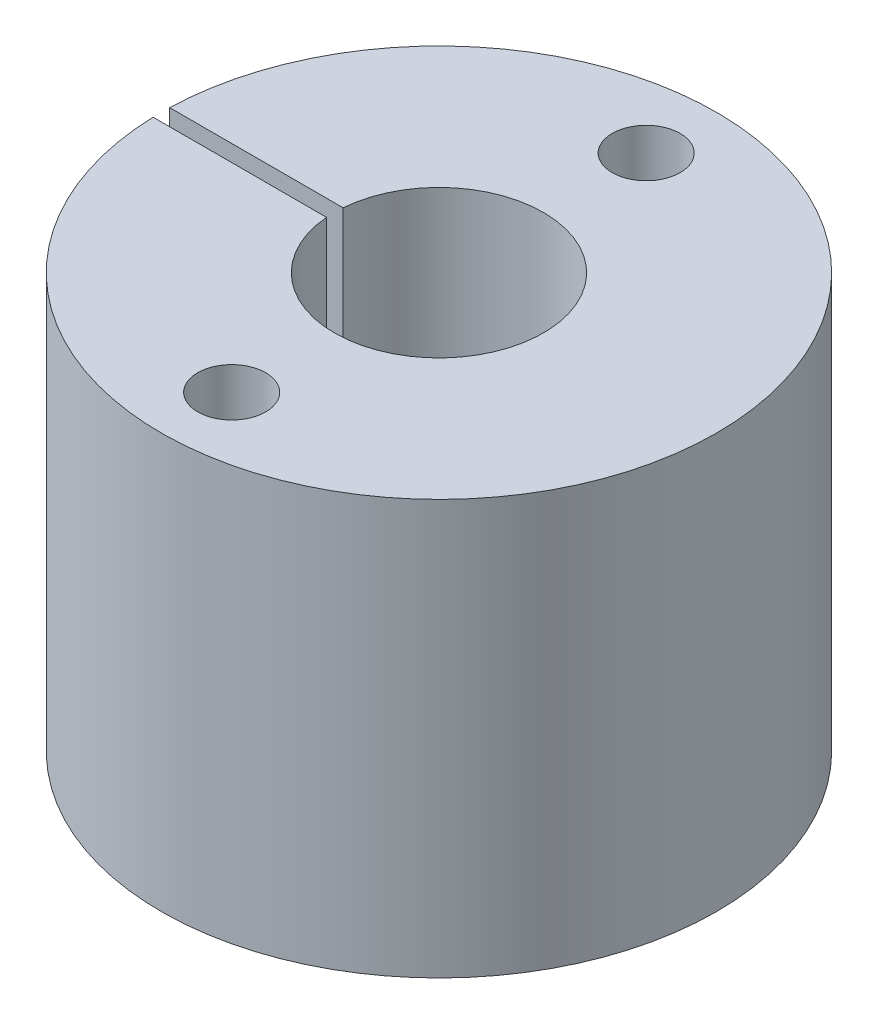
ISO-10303-21;
HEADER;
FILE_DESCRIPTION(('STEP AP214'),'2;1');
FILE_NAME('part.step','',(''),(''),'','','');
FILE_SCHEMA(('AUTOMOTIVE_DESIGN { 1 0 10303 214 1 1 1 1 }'));
ENDSEC;
DATA;
#1=APPLICATION_CONTEXT('core data for automotive mechanical design processes');
#2=APPLICATION_PROTOCOL_DEFINITION('international standard','automotive_design',2000,#1);
#3=PRODUCT_CONTEXT('',#1,'mechanical');
#4=PRODUCT('Part','Part','',(#3));
#5=PRODUCT_RELATED_PRODUCT_CATEGORY('part','',(#4));
#6=PRODUCT_DEFINITION_FORMATION('','',#4);
#7=PRODUCT_DEFINITION_CONTEXT('part definition',#1,'design');
#8=PRODUCT_DEFINITION('design','',#6,#7);
#9=PRODUCT_DEFINITION_SHAPE('','',#8);
#10=(LENGTH_UNIT() NAMED_UNIT(*) SI_UNIT(.MILLI.,.METRE.));
#11=(NAMED_UNIT(*) PLANE_ANGLE_UNIT() SI_UNIT($,.RADIAN.));
#12=(NAMED_UNIT(*) SI_UNIT($,.STERADIAN.) SOLID_ANGLE_UNIT());
#13=UNCERTAINTY_MEASURE_WITH_UNIT(LENGTH_MEASURE(1.E-05),#10,'distance_accuracy_value','');
#14=(GEOMETRIC_REPRESENTATION_CONTEXT(3) GLOBAL_UNCERTAINTY_ASSIGNED_CONTEXT((#13)) GLOBAL_UNIT_ASSIGNED_CONTEXT((#10,
#11,#12)) REPRESENTATION_CONTEXT('',''));
#15=CARTESIAN_POINT('',(0.,0.,0.));
#16=DIRECTION('',(0.,0.,1.));
#17=DIRECTION('',(1.,0.,0.));
#18=AXIS2_PLACEMENT_3D('',#15,#16,#17);
#19=CARTESIAN_POINT('',(0.,50.001,-25.));
#20=DIRECTION('',(0.,-1.,0.));
#21=DIRECTION('',(0.,0.,-1.));
#22=AXIS2_PLACEMENT_3D('',#19,#20,#21);
#23=CYLINDRICAL_SURFACE('',#22,4.1);
#24=CARTESIAN_POINT('',(0.,50.,-25.));
#25=DIRECTION('',(0.,1.,0.));
#26=DIRECTION('',(0.,0.,1.));
#27=AXIS2_PLACEMENT_3D('',#24,#25,#26);
#28=CIRCLE('',#27,4.1);
#29=CARTESIAN_POINT('',(0.,50.,-20.9));
#30=VERTEX_POINT('',#29);
#31=EDGE_CURVE('E254',#30,#30,#28,.F.);
#32=ORIENTED_EDGE('',*,*,#31,.F.);
#33=EDGE_LOOP('',(#32));
#34=FACE_BOUND('',#33,.T.);
#35=CARTESIAN_POINT('',(0.,30.,-25.));
#36=DIRECTION('',(0.,-1.,0.));
#37=DIRECTION('',(0.,0.,-1.));
#38=AXIS2_PLACEMENT_3D('',#35,#36,#37);
#39=CIRCLE('',#38,4.1);
#40=CARTESIAN_POINT('',(0.,30.,-29.1));
#41=VERTEX_POINT('',#40);
#42=EDGE_CURVE('E38',#41,#41,#39,.F.);
#43=ORIENTED_EDGE('',*,*,#42,.F.);
#44=EDGE_LOOP('',(#43));
#45=FACE_BOUND('',#44,.T.);
#46=ADVANCED_FACE('F34',(#34,#45),#23,.F.);
#47=CARTESIAN_POINT('',(0.,50.001,25.));
#48=DIRECTION('',(0.,-1.,0.));
#49=DIRECTION('',(0.,0.,-1.));
#50=AXIS2_PLACEMENT_3D('',#47,#48,#49);
#51=CYLINDRICAL_SURFACE('',#50,4.1);
#52=CARTESIAN_POINT('',(0.,50.,25.));
#53=DIRECTION('',(0.,1.,0.));
#54=DIRECTION('',(0.,0.,1.));
#55=AXIS2_PLACEMENT_3D('',#52,#53,#54);
#56=CIRCLE('',#55,4.1);
#57=CARTESIAN_POINT('',(0.,50.,29.1));
#58=VERTEX_POINT('',#57);
#59=EDGE_CURVE('E250',#58,#58,#56,.F.);
#60=ORIENTED_EDGE('',*,*,#59,.F.);
#61=EDGE_LOOP('',(#60));
#62=FACE_BOUND('',#61,.T.);
#63=CARTESIAN_POINT('',(0.,30.,25.));
#64=DIRECTION('',(0.,-1.,0.));
#65=DIRECTION('',(0.,0.,-1.));
#66=AXIS2_PLACEMENT_3D('',#63,#64,#65);
#67=CIRCLE('',#66,4.1);
#68=CARTESIAN_POINT('',(0.,30.,20.9));
#69=VERTEX_POINT('',#68);
#70=EDGE_CURVE('E197',#69,#69,#67,.F.);
#71=ORIENTED_EDGE('',*,*,#70,.F.);
#72=EDGE_LOOP('',(#71));
#73=FACE_BOUND('',#72,.T.);
#74=ADVANCED_FACE('F289',(#62,#73),#51,.F.);
#75=CARTESIAN_POINT('',(0.,50.,0.));
#76=DIRECTION('',(0.,-1.,0.));
#77=DIRECTION('',(0.,0.,-1.));
#78=AXIS2_PLACEMENT_3D('',#75,#76,#77);
#79=CYLINDRICAL_SURFACE('',#78,12.6);
#80=CARTESIAN_POINT('',(0.,0.,0.));
#81=DIRECTION('',(0.,1.,0.));
#82=DIRECTION('',(0.,0.,1.));
#83=AXIS2_PLACEMENT_3D('',#80,#81,#82);
#84=CIRCLE('',#83,12.6);
#85=CARTESIAN_POINT('',(-12.5602547744861,0.,1.));
#86=VERTEX_POINT('',#85);
#87=CARTESIAN_POINT('',(-12.5602547744861,0.,-0.999999999999997));
#88=VERTEX_POINT('',#87);
#89=EDGE_CURVE('E253',#86,#88,#84,.T.);
#90=ORIENTED_EDGE('',*,*,#89,.F.);
#91=DIRECTION('',(0.,-1.,0.));
#92=VECTOR('',#91,1.);
#93=CARTESIAN_POINT('',(-12.5602547744861,50.,1.));
#94=LINE('',#93,#92);
#95=CARTESIAN_POINT('',(-12.5602547744861,50.,1.));
#96=VERTEX_POINT('',#95);
#97=EDGE_CURVE('E11',#96,#86,#94,.T.);
#98=ORIENTED_EDGE('',*,*,#97,.F.);
#99=CARTESIAN_POINT('',(0.,50.,0.));
#100=DIRECTION('',(0.,1.,0.));
#101=DIRECTION('',(0.,0.,1.));
#102=AXIS2_PLACEMENT_3D('',#99,#100,#101);
#103=CIRCLE('',#102,12.6);
#104=CARTESIAN_POINT('',(-12.5602547744861,50.,-0.999999999999997));
#105=VERTEX_POINT('',#104);
#106=EDGE_CURVE('E257',#96,#105,#103,.T.);
#107=ORIENTED_EDGE('',*,*,#106,.T.);
#108=DIRECTION('',(0.,-1.,0.));
#109=VECTOR('',#108,1.);
#110=CARTESIAN_POINT('',(-12.5602547744861,50.,-0.999999999999997));
#111=LINE('',#110,#109);
#112=EDGE_CURVE('E267',#105,#88,#111,.T.);
#113=ORIENTED_EDGE('',*,*,#112,.T.);
#114=EDGE_LOOP('',(#90,#98,#107,#113));
#115=FACE_BOUND('',#114,.T.);
#116=ADVANCED_FACE('F36',(#115),#79,.F.);
#117=CARTESIAN_POINT('',(0.,50.,0.999999999999999));
#118=DIRECTION('',(0.,0.,1.));
#119=DIRECTION('',(1.,0.,0.));
#120=AXIS2_PLACEMENT_3D('',#117,#118,#119);
#121=PLANE('',#120);
#122=DIRECTION('',(-1.,0.,0.));
#123=VECTOR('',#122,1.);
#124=CARTESIAN_POINT('',(0.,0.,0.999999999999999));
#125=LINE('',#124,#123);
#126=CARTESIAN_POINT('',(-33.4850713005064,0.,1.));
#127=VERTEX_POINT('',#126);
#128=EDGE_CURVE('E270',#86,#127,#125,.T.);
#129=ORIENTED_EDGE('',*,*,#128,.T.);
#130=DIRECTION('',(0.,-1.,0.));
#131=VECTOR('',#130,1.);
#132=CARTESIAN_POINT('',(-33.4850713005064,50.,1.));
#133=LINE('',#132,#131);
#134=CARTESIAN_POINT('',(-33.4850713005064,50.,1.));
#135=VERTEX_POINT('',#134);
#136=EDGE_CURVE('E43',#135,#127,#133,.T.);
#137=ORIENTED_EDGE('',*,*,#136,.F.);
#138=DIRECTION('',(-1.,0.,0.));
#139=VECTOR('',#138,1.);
#140=CARTESIAN_POINT('',(0.,50.,0.999999999999999));
#141=LINE('',#140,#139);
#142=EDGE_CURVE('E260',#96,#135,#141,.T.);
#143=ORIENTED_EDGE('',*,*,#142,.F.);
#144=ORIENTED_EDGE('',*,*,#97,.T.);
#145=EDGE_LOOP('',(#129,#137,#143,#144));
#146=FACE_BOUND('',#145,.T.);
#147=ADVANCED_FACE('F314',(#146),#121,.F.);
#148=CARTESIAN_POINT('',(0.,50.,0.));
#149=DIRECTION('',(0.,-1.,0.));
#150=DIRECTION('',(0.,0.,-1.));
#151=AXIS2_PLACEMENT_3D('',#148,#149,#150);
#152=CYLINDRICAL_SURFACE('',#151,33.5);
#153=CARTESIAN_POINT('',(0.,0.,0.));
#154=DIRECTION('',(0.,1.,0.));
#155=DIRECTION('',(0.,0.,1.));
#156=AXIS2_PLACEMENT_3D('',#153,#154,#155);
#157=CIRCLE('',#156,33.5);
#158=CARTESIAN_POINT('',(-33.4850713005064,0.,-0.999999999999997));
#159=VERTEX_POINT('',#158);
#160=EDGE_CURVE('E272',#127,#159,#157,.T.);
#161=ORIENTED_EDGE('',*,*,#160,.T.);
#162=DIRECTION('',(0.,-1.,0.));
#163=VECTOR('',#162,1.);
#164=CARTESIAN_POINT('',(-33.4850713005064,50.,-0.999999999999997));
#165=LINE('',#164,#163);
#166=CARTESIAN_POINT('',(-33.4850713005064,50.,-0.999999999999997));
#167=VERTEX_POINT('',#166);
#168=EDGE_CURVE('E277',#167,#159,#165,.T.);
#169=ORIENTED_EDGE('',*,*,#168,.F.);
#170=CARTESIAN_POINT('',(0.,50.,0.));
#171=DIRECTION('',(0.,1.,0.));
#172=DIRECTION('',(0.,0.,1.));
#173=AXIS2_PLACEMENT_3D('',#170,#171,#172);
#174=CIRCLE('',#173,33.5);
#175=EDGE_CURVE('E263',#135,#167,#174,.T.);
#176=ORIENTED_EDGE('',*,*,#175,.F.);
#177=ORIENTED_EDGE('',*,*,#136,.T.);
#178=EDGE_LOOP('',(#161,#169,#176,#177));
#179=FACE_BOUND('',#178,.T.);
#180=ADVANCED_FACE('F311',(#179),#152,.T.);
#181=CARTESIAN_POINT('',(0.,50.,-0.999999999999997));
#182=DIRECTION('',(0.,0.,-1.));
#183=DIRECTION('',(-1.,0.,0.));
#184=AXIS2_PLACEMENT_3D('',#181,#182,#183);
#185=PLANE('',#184);
#186=DIRECTION('',(1.,0.,0.));
#187=VECTOR('',#186,1.);
#188=CARTESIAN_POINT('',(0.,0.,-0.999999999999997));
#189=LINE('',#188,#187);
#190=EDGE_CURVE('E261',#159,#88,#189,.T.);
#191=ORIENTED_EDGE('',*,*,#190,.T.);
#192=ORIENTED_EDGE('',*,*,#112,.F.);
#193=DIRECTION('',(1.,0.,0.));
#194=VECTOR('',#193,1.);
#195=CARTESIAN_POINT('',(0.,50.,-0.999999999999997));
#196=LINE('',#195,#194);
#197=EDGE_CURVE('E265',#167,#105,#196,.T.);
#198=ORIENTED_EDGE('',*,*,#197,.F.);
#199=ORIENTED_EDGE('',*,*,#168,.T.);
#200=EDGE_LOOP('',(#191,#192,#198,#199));
#201=FACE_BOUND('',#200,.T.);
#202=ADVANCED_FACE('F304',(#201),#185,.F.);
#203=CARTESIAN_POINT('',(0.,50.,0.));
#204=DIRECTION('',(0.,1.,0.));
#205=DIRECTION('',(0.,0.,1.));
#206=AXIS2_PLACEMENT_3D('',#203,#204,#205);
#207=PLANE('',#206);
#208=ORIENTED_EDGE('',*,*,#59,.T.);
#209=EDGE_LOOP('',(#208));
#210=FACE_BOUND('',#209,.T.);
#211=ORIENTED_EDGE('',*,*,#31,.T.);
#212=EDGE_LOOP('',(#211));
#213=FACE_BOUND('',#212,.T.);
#214=ORIENTED_EDGE('',*,*,#106,.F.);
#215=ORIENTED_EDGE('',*,*,#142,.T.);
#216=ORIENTED_EDGE('',*,*,#175,.T.);
#217=ORIENTED_EDGE('',*,*,#197,.T.);
#218=EDGE_LOOP('',(#214,#215,#216,#217));
#219=FACE_BOUND('',#218,.T.);
#220=ADVANCED_FACE('F300',(#210,#213,#219),#207,.T.);
#221=CARTESIAN_POINT('',(0.,0.,0.));
#222=DIRECTION('',(0.,1.,0.));
#223=DIRECTION('',(0.,0.,1.));
#224=AXIS2_PLACEMENT_3D('',#221,#222,#223);
#225=PLANE('',#224);
#226=DIRECTION('',(-0.00485619934996557,0.,0.999988208594418));
#227=VECTOR('',#226,1.);
#228=CARTESIAN_POINT('',(6.61842678153596,0.,21.2215840703481));
#229=LINE('',#228,#227);
#230=CARTESIAN_POINT('',(6.61842678153596,0.,21.2215840703481));
#231=VERTEX_POINT('',#230);
#232=CARTESIAN_POINT('',(6.58141757191034,0.,28.8425177610715));
#233=VERTEX_POINT('',#232);
#234=EDGE_CURVE('E184',#231,#233,#229,.T.);
#235=ORIENTED_EDGE('',*,*,#234,.F.);
#236=DIRECTION('',(0.863587092452676,0.,0.504199696300121));
#237=VECTOR('',#236,1.);
#238=CARTESIAN_POINT('',(0.0370092096256153,0.,17.3790663092766));
#239=LINE('',#238,#237);
#240=CARTESIAN_POINT('',(0.0370092096256153,0.,17.3790663092766));
#241=VERTEX_POINT('',#240);
#242=EDGE_CURVE('E51',#241,#231,#239,.T.);
#243=ORIENTED_EDGE('',*,*,#242,.F.);
#244=DIRECTION('',(0.868443291802641,0.,-0.495788512294298));
#245=VECTOR('',#244,1.);
#246=CARTESIAN_POINT('',(-6.58141757191035,0.,21.1574822389285));
#247=LINE('',#246,#245);
#248=CARTESIAN_POINT('',(-6.58141757191035,0.,21.1574822389285));
#249=VERTEX_POINT('',#248);
#250=EDGE_CURVE('E170',#249,#241,#247,.T.);
#251=ORIENTED_EDGE('',*,*,#250,.F.);
#252=DIRECTION('',(0.00485619934996533,0.,-0.999988208594418));
#253=VECTOR('',#252,1.);
#254=CARTESIAN_POINT('',(-6.61842678153597,0.,28.7784159296519));
#255=LINE('',#254,#253);
#256=CARTESIAN_POINT('',(-6.61842678153597,0.,28.7784159296519));
#257=VERTEX_POINT('',#256);
#258=EDGE_CURVE('E173',#257,#249,#255,.T.);
#259=ORIENTED_EDGE('',*,*,#258,.F.);
#260=DIRECTION('',(-0.863587092452676,0.,-0.504199696300121));
#261=VECTOR('',#260,1.);
#262=CARTESIAN_POINT('',(-0.0370092096256262,0.,32.6209336907234));
#263=LINE('',#262,#261);
#264=CARTESIAN_POINT('',(-0.0370092096256262,0.,32.6209336907234));
#265=VERTEX_POINT('',#264);
#266=EDGE_CURVE('E190',#265,#257,#263,.T.);
#267=ORIENTED_EDGE('',*,*,#266,.F.);
#268=DIRECTION('',(-0.868443291802641,0.,0.495788512294298));
#269=VECTOR('',#268,1.);
#270=CARTESIAN_POINT('',(6.58141757191034,0.,28.8425177610715));
#271=LINE('',#270,#269);
#272=EDGE_CURVE('E187',#233,#265,#271,.T.);
#273=ORIENTED_EDGE('',*,*,#272,.F.);
#274=EDGE_LOOP('',(#235,#243,#251,#259,#267,#273));
#275=FACE_BOUND('',#274,.T.);
#276=DIRECTION('',(-0.00485619934996523,0.,0.999988208594418));
#277=VECTOR('',#276,1.);
#278=CARTESIAN_POINT('',(6.61842678153598,0.,-28.7784159296519));
#279=LINE('',#278,#277);
#280=CARTESIAN_POINT('',(6.61842678153598,0.,-28.7784159296519));
#281=VERTEX_POINT('',#280);
#282=CARTESIAN_POINT('',(6.58141757191036,0.,-21.1574822389285));
#283=VERTEX_POINT('',#282);
#284=EDGE_CURVE('E226',#281,#283,#279,.T.);
#285=ORIENTED_EDGE('',*,*,#284,.F.);
#286=DIRECTION('',(0.863587092452675,0.,0.504199696300121));
#287=VECTOR('',#286,1.);
#288=CARTESIAN_POINT('',(0.0370092096256217,0.,-32.6209336907234));
#289=LINE('',#288,#287);
#290=CARTESIAN_POINT('',(0.0370092096256217,0.,-32.6209336907234));
#291=VERTEX_POINT('',#290);
#292=EDGE_CURVE('E59',#291,#281,#289,.T.);
#293=ORIENTED_EDGE('',*,*,#292,.F.);
#294=DIRECTION('',(0.868443291802641,0.,-0.495788512294298));
#295=VECTOR('',#294,1.);
#296=CARTESIAN_POINT('',(-6.58141757191034,0.,-28.8425177610715));
#297=LINE('',#296,#295);
#298=CARTESIAN_POINT('',(-6.58141757191034,0.,-28.8425177610715));
#299=VERTEX_POINT('',#298);
#300=EDGE_CURVE('E209',#299,#291,#297,.T.);
#301=ORIENTED_EDGE('',*,*,#300,.F.);
#302=DIRECTION('',(0.00485619934996534,0.,-0.999988208594418));
#303=VECTOR('',#302,1.);
#304=CARTESIAN_POINT('',(-6.61842678153596,0.,-21.2215840703481));
#305=LINE('',#304,#303);
#306=CARTESIAN_POINT('',(-6.61842678153596,0.,-21.2215840703481));
#307=VERTEX_POINT('',#306);
#308=EDGE_CURVE('E235',#307,#299,#305,.T.);
#309=ORIENTED_EDGE('',*,*,#308,.F.);
#310=DIRECTION('',(-0.863587092452676,0.,-0.504199696300121));
#311=VECTOR('',#310,1.);
#312=CARTESIAN_POINT('',(-0.0370092096256104,0.,-17.3790663092766));
#313=LINE('',#312,#311);
#314=CARTESIAN_POINT('',(-0.0370092096256104,0.,-17.3790663092766));
#315=VERTEX_POINT('',#314);
#316=EDGE_CURVE('E232',#315,#307,#313,.T.);
#317=ORIENTED_EDGE('',*,*,#316,.F.);
#318=DIRECTION('',(-0.868443291802641,0.,0.495788512294298));
#319=VECTOR('',#318,1.);
#320=CARTESIAN_POINT('',(6.58141757191036,0.,-21.1574822389285));
#321=LINE('',#320,#319);
#322=EDGE_CURVE('E229',#283,#315,#321,.T.);
#323=ORIENTED_EDGE('',*,*,#322,.F.);
#324=EDGE_LOOP('',(#285,#293,#301,#309,#317,#323));
#325=FACE_BOUND('',#324,.T.);
#326=ORIENTED_EDGE('',*,*,#89,.T.);
#327=ORIENTED_EDGE('',*,*,#190,.F.);
#328=ORIENTED_EDGE('',*,*,#160,.F.);
#329=ORIENTED_EDGE('',*,*,#128,.F.);
#330=EDGE_LOOP('',(#326,#327,#328,#329));
#331=FACE_BOUND('',#330,.T.);
#332=ADVANCED_FACE('F303',(#275,#325,#331),#225,.F.);
#333=CARTESIAN_POINT('',(0.,30.,0.));
#334=DIRECTION('',(0.,-1.,0.));
#335=DIRECTION('',(0.,0.,-1.));
#336=AXIS2_PLACEMENT_3D('',#333,#334,#335);
#337=PLANE('',#336);
#338=DIRECTION('',(0.863587092452676,0.,0.504199696300121));
#339=VECTOR('',#338,1.);
#340=CARTESIAN_POINT('',(0.0370092096256153,30.,17.3790663092766));
#341=LINE('',#340,#339);
#342=CARTESIAN_POINT('',(0.0370092096256153,30.,17.3790663092766));
#343=VERTEX_POINT('',#342);
#344=CARTESIAN_POINT('',(6.61842678153596,30.,21.2215840703481));
#345=VERTEX_POINT('',#344);
#346=EDGE_CURVE('E150',#343,#345,#341,.T.);
#347=ORIENTED_EDGE('',*,*,#346,.T.);
#348=DIRECTION('',(-0.00485619934996557,0.,0.999988208594418));
#349=VECTOR('',#348,1.);
#350=CARTESIAN_POINT('',(6.61842678153596,30.,21.2215840703481));
#351=LINE('',#350,#349);
#352=CARTESIAN_POINT('',(6.58141757191034,30.,28.8425177610715));
#353=VERTEX_POINT('',#352);
#354=EDGE_CURVE('E159',#345,#353,#351,.T.);
#355=ORIENTED_EDGE('',*,*,#354,.T.);
#356=DIRECTION('',(-0.868443291802641,0.,0.495788512294298));
#357=VECTOR('',#356,1.);
#358=CARTESIAN_POINT('',(6.58141757191034,30.,28.8425177610715));
#359=LINE('',#358,#357);
#360=CARTESIAN_POINT('',(-0.0370092096256262,30.,32.6209336907234));
#361=VERTEX_POINT('',#360);
#362=EDGE_CURVE('E164',#353,#361,#359,.T.);
#363=ORIENTED_EDGE('',*,*,#362,.T.);
#364=DIRECTION('',(-0.863587092452676,0.,-0.504199696300121));
#365=VECTOR('',#364,1.);
#366=CARTESIAN_POINT('',(-0.0370092096256262,30.,32.6209336907234));
#367=LINE('',#366,#365);
#368=CARTESIAN_POINT('',(-6.61842678153597,30.,28.7784159296519));
#369=VERTEX_POINT('',#368);
#370=EDGE_CURVE('E177',#361,#369,#367,.T.);
#371=ORIENTED_EDGE('',*,*,#370,.T.);
#372=DIRECTION('',(0.00485619934996533,0.,-0.999988208594418));
#373=VECTOR('',#372,1.);
#374=CARTESIAN_POINT('',(-6.61842678153597,30.,28.7784159296519));
#375=LINE('',#374,#373);
#376=CARTESIAN_POINT('',(-6.58141757191035,30.,21.1574822389285));
#377=VERTEX_POINT('',#376);
#378=EDGE_CURVE('E180',#369,#377,#375,.T.);
#379=ORIENTED_EDGE('',*,*,#378,.T.);
#380=DIRECTION('',(0.868443291802641,0.,-0.495788512294298));
#381=VECTOR('',#380,1.);
#382=CARTESIAN_POINT('',(-6.58141757191035,30.,21.1574822389285));
#383=LINE('',#382,#381);
#384=EDGE_CURVE('E156',#377,#343,#383,.T.);
#385=ORIENTED_EDGE('',*,*,#384,.T.);
#386=EDGE_LOOP('',(#347,#355,#363,#371,#379,#385));
#387=FACE_BOUND('',#386,.T.);
#388=ORIENTED_EDGE('',*,*,#70,.T.);
#389=EDGE_LOOP('',(#388));
#390=FACE_BOUND('',#389,.T.);
#391=ADVANCED_FACE('F166',(#387,#390),#337,.T.);
#392=CARTESIAN_POINT('',(0.0370092096256153,30.,17.3790663092766));
#393=DIRECTION('',(0.504199696300121,0.,-0.863587092452676));
#394=DIRECTION('',(-0.863587092452676,0.,-0.504199696300121));
#395=AXIS2_PLACEMENT_3D('',#392,#393,#394);
#396=PLANE('',#395);
#397=ORIENTED_EDGE('',*,*,#242,.T.);
#398=DIRECTION('',(0.,-1.,0.));
#399=VECTOR('',#398,1.);
#400=CARTESIAN_POINT('',(6.61842678153596,30.,21.2215840703481));
#401=LINE('',#400,#399);
#402=EDGE_CURVE('E146',#345,#231,#401,.T.);
#403=ORIENTED_EDGE('',*,*,#402,.F.);
#404=ORIENTED_EDGE('',*,*,#346,.F.);
#405=DIRECTION('',(0.,-1.,0.));
#406=VECTOR('',#405,1.);
#407=CARTESIAN_POINT('',(0.0370092096256153,30.,17.3790663092766));
#408=LINE('',#407,#406);
#409=EDGE_CURVE('E195',#343,#241,#408,.T.);
#410=ORIENTED_EDGE('',*,*,#409,.T.);
#411=EDGE_LOOP('',(#397,#403,#404,#410));
#412=FACE_BOUND('',#411,.T.);
#413=ADVANCED_FACE('F148',(#412),#396,.F.);
#414=CARTESIAN_POINT('',(-6.58141757191035,30.,21.1574822389285));
#415=DIRECTION('',(-0.495788512294298,0.,-0.868443291802641));
#416=DIRECTION('',(-0.868443291802641,0.,0.495788512294298));
#417=AXIS2_PLACEMENT_3D('',#414,#415,#416);
#418=PLANE('',#417);
#419=ORIENTED_EDGE('',*,*,#250,.T.);
#420=ORIENTED_EDGE('',*,*,#409,.F.);
#421=ORIENTED_EDGE('',*,*,#384,.F.);
#422=DIRECTION('',(0.,-1.,0.));
#423=VECTOR('',#422,1.);
#424=CARTESIAN_POINT('',(-6.58141757191035,30.,21.1574822389285));
#425=LINE('',#424,#423);
#426=EDGE_CURVE('E198',#377,#249,#425,.T.);
#427=ORIENTED_EDGE('',*,*,#426,.T.);
#428=EDGE_LOOP('',(#419,#420,#421,#427));
#429=FACE_BOUND('',#428,.T.);
#430=ADVANCED_FACE('F368',(#429),#418,.F.);
#431=CARTESIAN_POINT('',(-6.61842678153597,30.,28.7784159296519));
#432=DIRECTION('',(-0.999988208594418,0.,-0.00485619934996533));
#433=DIRECTION('',(-0.00485619934996533,0.,0.999988208594418));
#434=AXIS2_PLACEMENT_3D('',#431,#432,#433);
#435=PLANE('',#434);
#436=ORIENTED_EDGE('',*,*,#258,.T.);
#437=ORIENTED_EDGE('',*,*,#426,.F.);
#438=ORIENTED_EDGE('',*,*,#378,.F.);
#439=DIRECTION('',(0.,-1.,0.));
#440=VECTOR('',#439,1.);
#441=CARTESIAN_POINT('',(-6.61842678153597,30.,28.7784159296519));
#442=LINE('',#441,#440);
#443=EDGE_CURVE('E200',#369,#257,#442,.T.);
#444=ORIENTED_EDGE('',*,*,#443,.T.);
#445=EDGE_LOOP('',(#436,#437,#438,#444));
#446=FACE_BOUND('',#445,.T.);
#447=ADVANCED_FACE('F377',(#446),#435,.F.);
#448=CARTESIAN_POINT('',(-0.0370092096256262,30.,32.6209336907234));
#449=DIRECTION('',(-0.504199696300121,0.,0.863587092452676));
#450=DIRECTION('',(0.863587092452676,0.,0.504199696300121));
#451=AXIS2_PLACEMENT_3D('',#448,#449,#450);
#452=PLANE('',#451);
#453=ORIENTED_EDGE('',*,*,#266,.T.);
#454=ORIENTED_EDGE('',*,*,#443,.F.);
#455=ORIENTED_EDGE('',*,*,#370,.F.);
#456=DIRECTION('',(0.,-1.,0.));
#457=VECTOR('',#456,1.);
#458=CARTESIAN_POINT('',(-0.0370092096256262,30.,32.6209336907234));
#459=LINE('',#458,#457);
#460=EDGE_CURVE('E202',#361,#265,#459,.T.);
#461=ORIENTED_EDGE('',*,*,#460,.T.);
#462=EDGE_LOOP('',(#453,#454,#455,#461));
#463=FACE_BOUND('',#462,.T.);
#464=ADVANCED_FACE('F387',(#463),#452,.F.);
#465=CARTESIAN_POINT('',(6.58141757191034,30.,28.8425177610715));
#466=DIRECTION('',(0.495788512294298,0.,0.868443291802641));
#467=DIRECTION('',(0.868443291802641,0.,-0.495788512294298));
#468=AXIS2_PLACEMENT_3D('',#465,#466,#467);
#469=PLANE('',#468);
#470=ORIENTED_EDGE('',*,*,#272,.T.);
#471=ORIENTED_EDGE('',*,*,#460,.F.);
#472=ORIENTED_EDGE('',*,*,#362,.F.);
#473=DIRECTION('',(0.,-1.,0.));
#474=VECTOR('',#473,1.);
#475=CARTESIAN_POINT('',(6.58141757191034,30.,28.8425177610715));
#476=LINE('',#475,#474);
#477=EDGE_CURVE('E155',#353,#233,#476,.T.);
#478=ORIENTED_EDGE('',*,*,#477,.T.);
#479=EDGE_LOOP('',(#470,#471,#472,#478));
#480=FACE_BOUND('',#479,.T.);
#481=ADVANCED_FACE('F397',(#480),#469,.F.);
#482=CARTESIAN_POINT('',(6.61842678153596,30.,21.2215840703481));
#483=DIRECTION('',(0.999988208594418,0.,0.00485619934996557));
#484=DIRECTION('',(0.00485619934996557,0.,-0.999988208594418));
#485=AXIS2_PLACEMENT_3D('',#482,#483,#484);
#486=PLANE('',#485);
#487=ORIENTED_EDGE('',*,*,#234,.T.);
#488=ORIENTED_EDGE('',*,*,#477,.F.);
#489=ORIENTED_EDGE('',*,*,#354,.F.);
#490=ORIENTED_EDGE('',*,*,#402,.T.);
#491=EDGE_LOOP('',(#487,#488,#489,#490));
#492=FACE_BOUND('',#491,.T.);
#493=ADVANCED_FACE('F160',(#492),#486,.F.);
#494=CARTESIAN_POINT('',(0.,30.,0.));
#495=DIRECTION('',(0.,-1.,0.));
#496=DIRECTION('',(0.,0.,-1.));
#497=AXIS2_PLACEMENT_3D('',#494,#495,#496);
#498=PLANE('',#497);
#499=DIRECTION('',(0.863587092452675,0.,0.504199696300121));
#500=VECTOR('',#499,1.);
#501=CARTESIAN_POINT('',(0.0370092096256217,30.,-32.6209336907234));
#502=LINE('',#501,#500);
#503=CARTESIAN_POINT('',(0.0370092096256217,30.,-32.6209336907234));
#504=VERTEX_POINT('',#503);
#505=CARTESIAN_POINT('',(6.61842678153598,30.,-28.7784159296519));
#506=VERTEX_POINT('',#505);
#507=EDGE_CURVE('E205',#504,#506,#502,.T.);
#508=ORIENTED_EDGE('',*,*,#507,.T.);
#509=DIRECTION('',(-0.00485619934996523,0.,0.999988208594418));
#510=VECTOR('',#509,1.);
#511=CARTESIAN_POINT('',(6.61842678153598,30.,-28.7784159296519));
#512=LINE('',#511,#510);
#513=CARTESIAN_POINT('',(6.58141757191036,30.,-21.1574822389285));
#514=VERTEX_POINT('',#513);
#515=EDGE_CURVE('E208',#506,#514,#512,.T.);
#516=ORIENTED_EDGE('',*,*,#515,.T.);
#517=DIRECTION('',(-0.868443291802641,0.,0.495788512294298));
#518=VECTOR('',#517,1.);
#519=CARTESIAN_POINT('',(6.58141757191036,30.,-21.1574822389285));
#520=LINE('',#519,#518);
#521=CARTESIAN_POINT('',(-0.0370092096256104,30.,-17.3790663092766));
#522=VERTEX_POINT('',#521);
#523=EDGE_CURVE('E212',#514,#522,#520,.T.);
#524=ORIENTED_EDGE('',*,*,#523,.T.);
#525=DIRECTION('',(-0.863587092452676,0.,-0.504199696300121));
#526=VECTOR('',#525,1.);
#527=CARTESIAN_POINT('',(-0.0370092096256104,30.,-17.3790663092766));
#528=LINE('',#527,#526);
#529=CARTESIAN_POINT('',(-6.61842678153596,30.,-21.2215840703481));
#530=VERTEX_POINT('',#529);
#531=EDGE_CURVE('E215',#522,#530,#528,.T.);
#532=ORIENTED_EDGE('',*,*,#531,.T.);
#533=DIRECTION('',(0.00485619934996534,0.,-0.999988208594418));
#534=VECTOR('',#533,1.);
#535=CARTESIAN_POINT('',(-6.61842678153596,30.,-21.2215840703481));
#536=LINE('',#535,#534);
#537=CARTESIAN_POINT('',(-6.58141757191034,30.,-28.8425177610715));
#538=VERTEX_POINT('',#537);
#539=EDGE_CURVE('E218',#530,#538,#536,.T.);
#540=ORIENTED_EDGE('',*,*,#539,.T.);
#541=DIRECTION('',(0.868443291802641,0.,-0.495788512294298));
#542=VECTOR('',#541,1.);
#543=CARTESIAN_POINT('',(-6.58141757191034,30.,-28.8425177610715));
#544=LINE('',#543,#542);
#545=EDGE_CURVE('E221',#538,#504,#544,.T.);
#546=ORIENTED_EDGE('',*,*,#545,.T.);
#547=EDGE_LOOP('',(#508,#516,#524,#532,#540,#546));
#548=FACE_BOUND('',#547,.T.);
#549=ORIENTED_EDGE('',*,*,#42,.T.);
#550=EDGE_LOOP('',(#549));
#551=FACE_BOUND('',#550,.T.);
#552=ADVANCED_FACE('F286',(#548,#551),#498,.T.);
#553=CARTESIAN_POINT('',(0.0370092096256217,30.,-32.6209336907234));
#554=DIRECTION('',(0.504199696300121,0.,-0.863587092452676));
#555=DIRECTION('',(-0.863587092452676,0.,-0.504199696300121));
#556=AXIS2_PLACEMENT_3D('',#553,#554,#555);
#557=PLANE('',#556);
#558=ORIENTED_EDGE('',*,*,#292,.T.);
#559=DIRECTION('',(0.,-1.,0.));
#560=VECTOR('',#559,1.);
#561=CARTESIAN_POINT('',(6.61842678153598,30.,-28.7784159296519));
#562=LINE('',#561,#560);
#563=EDGE_CURVE('E224',#506,#281,#562,.T.);
#564=ORIENTED_EDGE('',*,*,#563,.F.);
#565=ORIENTED_EDGE('',*,*,#507,.F.);
#566=DIRECTION('',(0.,-1.,0.));
#567=VECTOR('',#566,1.);
#568=CARTESIAN_POINT('',(0.0370092096256217,30.,-32.6209336907234));
#569=LINE('',#568,#567);
#570=EDGE_CURVE('E185',#504,#291,#569,.T.);
#571=ORIENTED_EDGE('',*,*,#570,.T.);
#572=EDGE_LOOP('',(#558,#564,#565,#571));
#573=FACE_BOUND('',#572,.T.);
#574=ADVANCED_FACE('F424',(#573),#557,.F.);
#575=CARTESIAN_POINT('',(-6.58141757191034,30.,-28.8425177610715));
#576=DIRECTION('',(-0.495788512294298,0.,-0.868443291802641));
#577=DIRECTION('',(-0.868443291802641,0.,0.495788512294298));
#578=AXIS2_PLACEMENT_3D('',#575,#576,#577);
#579=PLANE('',#578);
#580=ORIENTED_EDGE('',*,*,#300,.T.);
#581=ORIENTED_EDGE('',*,*,#570,.F.);
#582=ORIENTED_EDGE('',*,*,#545,.F.);
#583=DIRECTION('',(0.,-1.,0.));
#584=VECTOR('',#583,1.);
#585=CARTESIAN_POINT('',(-6.58141757191034,30.,-28.8425177610715));
#586=LINE('',#585,#584);
#587=EDGE_CURVE('E241',#538,#299,#586,.T.);
#588=ORIENTED_EDGE('',*,*,#587,.T.);
#589=EDGE_LOOP('',(#580,#581,#582,#588));
#590=FACE_BOUND('',#589,.T.);
#591=ADVANCED_FACE('F434',(#590),#579,.F.);
#592=CARTESIAN_POINT('',(-6.61842678153596,30.,-21.2215840703481));
#593=DIRECTION('',(-0.999988208594418,0.,-0.00485619934996534));
#594=DIRECTION('',(-0.00485619934996534,0.,0.999988208594418));
#595=AXIS2_PLACEMENT_3D('',#592,#593,#594);
#596=PLANE('',#595);
#597=ORIENTED_EDGE('',*,*,#308,.T.);
#598=ORIENTED_EDGE('',*,*,#587,.F.);
#599=ORIENTED_EDGE('',*,*,#539,.F.);
#600=DIRECTION('',(0.,-1.,0.));
#601=VECTOR('',#600,1.);
#602=CARTESIAN_POINT('',(-6.61842678153596,30.,-21.2215840703481));
#603=LINE('',#602,#601);
#604=EDGE_CURVE('E243',#530,#307,#603,.T.);
#605=ORIENTED_EDGE('',*,*,#604,.T.);
#606=EDGE_LOOP('',(#597,#598,#599,#605));
#607=FACE_BOUND('',#606,.T.);
#608=ADVANCED_FACE('F442',(#607),#596,.F.);
#609=CARTESIAN_POINT('',(-0.0370092096256104,30.,-17.3790663092766));
#610=DIRECTION('',(-0.504199696300121,0.,0.863587092452676));
#611=DIRECTION('',(0.863587092452676,0.,0.504199696300121));
#612=AXIS2_PLACEMENT_3D('',#609,#610,#611);
#613=PLANE('',#612);
#614=ORIENTED_EDGE('',*,*,#316,.T.);
#615=ORIENTED_EDGE('',*,*,#604,.F.);
#616=ORIENTED_EDGE('',*,*,#531,.F.);
#617=DIRECTION('',(0.,-1.,0.));
#618=VECTOR('',#617,1.);
#619=CARTESIAN_POINT('',(-0.0370092096256104,30.,-17.3790663092766));
#620=LINE('',#619,#618);
#621=EDGE_CURVE('E245',#522,#315,#620,.T.);
#622=ORIENTED_EDGE('',*,*,#621,.T.);
#623=EDGE_LOOP('',(#614,#615,#616,#622));
#624=FACE_BOUND('',#623,.T.);
#625=ADVANCED_FACE('F452',(#624),#613,.F.);
#626=CARTESIAN_POINT('',(6.58141757191036,30.,-21.1574822389285));
#627=DIRECTION('',(0.495788512294298,0.,0.868443291802641));
#628=DIRECTION('',(0.868443291802641,0.,-0.495788512294298));
#629=AXIS2_PLACEMENT_3D('',#626,#627,#628);
#630=PLANE('',#629);
#631=ORIENTED_EDGE('',*,*,#322,.T.);
#632=ORIENTED_EDGE('',*,*,#621,.F.);
#633=ORIENTED_EDGE('',*,*,#523,.F.);
#634=DIRECTION('',(0.,-1.,0.));
#635=VECTOR('',#634,1.);
#636=CARTESIAN_POINT('',(6.58141757191036,30.,-21.1574822389285));
#637=LINE('',#636,#635);
#638=EDGE_CURVE('E247',#514,#283,#637,.T.);
#639=ORIENTED_EDGE('',*,*,#638,.T.);
#640=EDGE_LOOP('',(#631,#632,#633,#639));
#641=FACE_BOUND('',#640,.T.);
#642=ADVANCED_FACE('F462',(#641),#630,.F.);
#643=CARTESIAN_POINT('',(6.61842678153598,30.,-28.7784159296519));
#644=DIRECTION('',(0.999988208594418,0.,0.00485619934996523));
#645=DIRECTION('',(0.00485619934996523,0.,-0.999988208594418));
#646=AXIS2_PLACEMENT_3D('',#643,#644,#645);
#647=PLANE('',#646);
#648=ORIENTED_EDGE('',*,*,#284,.T.);
#649=ORIENTED_EDGE('',*,*,#638,.F.);
#650=ORIENTED_EDGE('',*,*,#515,.F.);
#651=ORIENTED_EDGE('',*,*,#563,.T.);
#652=EDGE_LOOP('',(#648,#649,#650,#651));
#653=FACE_BOUND('',#652,.T.);
#654=ADVANCED_FACE('F472',(#653),#647,.F.);
#655=CLOSED_SHELL('',(#46,#74,#116,#147,#180,#202,#220,#332,#391,#413,#430,#447,#464,#481,#493,
#552,#574,#591,#608,#625,#642,#654));
#656=MANIFOLD_SOLID_BREP('B2',#655);
#657=ADVANCED_BREP_SHAPE_REPRESENTATION('',(#18,#656),#14);
#658=SHAPE_DEFINITION_REPRESENTATION(#9,#657);
ENDSEC;
END-ISO-10303-21;
